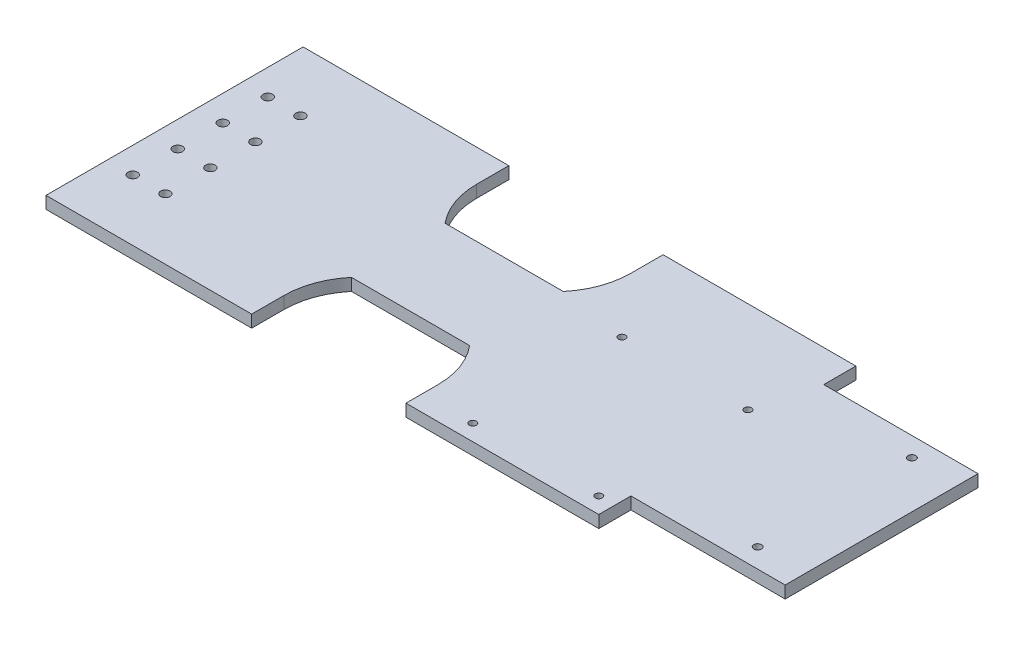
ISO-10303-21;
HEADER;
FILE_DESCRIPTION(('STEP AP214'),'2;1');
FILE_NAME('part.step','',(''),(''),'','','');
FILE_SCHEMA(('AUTOMOTIVE_DESIGN { 1 0 10303 214 1 1 1 1 }'));
ENDSEC;
DATA;
#1=APPLICATION_CONTEXT('core data for automotive mechanical design processes');
#2=APPLICATION_PROTOCOL_DEFINITION('international standard','automotive_design',2000,#1);
#3=PRODUCT_CONTEXT('',#1,'mechanical');
#4=PRODUCT('Part','Part','',(#3));
#5=PRODUCT_RELATED_PRODUCT_CATEGORY('part','',(#4));
#6=PRODUCT_DEFINITION_FORMATION('','',#4);
#7=PRODUCT_DEFINITION_CONTEXT('part definition',#1,'design');
#8=PRODUCT_DEFINITION('design','',#6,#7);
#9=PRODUCT_DEFINITION_SHAPE('','',#8);
#10=(LENGTH_UNIT() NAMED_UNIT(*) SI_UNIT(.MILLI.,.METRE.));
#11=(NAMED_UNIT(*) PLANE_ANGLE_UNIT() SI_UNIT($,.RADIAN.));
#12=(NAMED_UNIT(*) SI_UNIT($,.STERADIAN.) SOLID_ANGLE_UNIT());
#13=UNCERTAINTY_MEASURE_WITH_UNIT(LENGTH_MEASURE(1.E-05),#10,'distance_accuracy_value','');
#14=(GEOMETRIC_REPRESENTATION_CONTEXT(3) GLOBAL_UNCERTAINTY_ASSIGNED_CONTEXT((#13)) GLOBAL_UNIT_ASSIGNED_CONTEXT((#10,
#11,#12)) REPRESENTATION_CONTEXT('',''));
#15=CARTESIAN_POINT('',(0.,0.,0.));
#16=DIRECTION('',(0.,0.,1.));
#17=DIRECTION('',(1.,0.,0.));
#18=AXIS2_PLACEMENT_3D('',#15,#16,#17);
#19=CARTESIAN_POINT('',(-137.5,4.75,-50.));
#20=DIRECTION('',(0.,0.,1.));
#21=DIRECTION('',(1.,0.,0.));
#22=AXIS2_PLACEMENT_3D('',#19,#20,#21);
#23=PLANE('',#22);
#24=DIRECTION('',(-1.,0.,0.));
#25=VECTOR('',#24,1.);
#26=CARTESIAN_POINT('',(-137.5,4.75,-50.));
#27=LINE('',#26,#25);
#28=CARTESIAN_POINT('',(77.5,4.75,-50.));
#29=VERTEX_POINT('',#28);
#30=CARTESIAN_POINT('',(2.50000000000003,4.75,-50.));
#31=VERTEX_POINT('',#30);
#32=EDGE_CURVE('E193',#29,#31,#27,.T.);
#33=ORIENTED_EDGE('',*,*,#32,.F.);
#34=DIRECTION('',(0.,1.,0.));
#35=VECTOR('',#34,1.);
#36=CARTESIAN_POINT('',(77.5,-5.25,-50.));
#37=LINE('',#36,#35);
#38=CARTESIAN_POINT('',(77.5,0.,-50.));
#39=VERTEX_POINT('',#38);
#40=EDGE_CURVE('E422',#39,#29,#37,.T.);
#41=ORIENTED_EDGE('',*,*,#40,.F.);
#42=DIRECTION('',(-1.,0.,0.));
#43=VECTOR('',#42,1.);
#44=CARTESIAN_POINT('',(-137.5,0.,-50.));
#45=LINE('',#44,#43);
#46=CARTESIAN_POINT('',(2.50000000000003,0.,-50.));
#47=VERTEX_POINT('',#46);
#48=EDGE_CURVE('E195',#39,#47,#45,.T.);
#49=ORIENTED_EDGE('',*,*,#48,.T.);
#50=DIRECTION('',(0.,1.,0.));
#51=VECTOR('',#50,1.);
#52=CARTESIAN_POINT('',(2.50000000000003,-5.25,-50.));
#53=LINE('',#52,#51);
#54=EDGE_CURVE('E179',#47,#31,#53,.T.);
#55=ORIENTED_EDGE('',*,*,#54,.T.);
#56=EDGE_LOOP('',(#33,#41,#49,#55));
#57=FACE_BOUND('',#56,.T.);
#58=ADVANCED_FACE('F38',(#57),#23,.F.);
#59=CARTESIAN_POINT('',(-137.5,4.75,50.));
#60=DIRECTION('',(0.,0.,-1.));
#61=DIRECTION('',(-1.,0.,0.));
#62=AXIS2_PLACEMENT_3D('',#59,#60,#61);
#63=PLANE('',#62);
#64=DIRECTION('',(1.,0.,0.));
#65=VECTOR('',#64,1.);
#66=CARTESIAN_POINT('',(-137.5,4.75,50.));
#67=LINE('',#66,#65);
#68=CARTESIAN_POINT('',(2.50000000000002,4.75,50.));
#69=VERTEX_POINT('',#68);
#70=CARTESIAN_POINT('',(77.5,4.75,50.));
#71=VERTEX_POINT('',#70);
#72=EDGE_CURVE('E208',#69,#71,#67,.T.);
#73=ORIENTED_EDGE('',*,*,#72,.F.);
#74=DIRECTION('',(0.,1.,0.));
#75=VECTOR('',#74,1.);
#76=CARTESIAN_POINT('',(2.50000000000002,-5.25,50.));
#77=LINE('',#76,#75);
#78=CARTESIAN_POINT('',(2.50000000000002,0.,50.));
#79=VERTEX_POINT('',#78);
#80=EDGE_CURVE('E382',#79,#69,#77,.T.);
#81=ORIENTED_EDGE('',*,*,#80,.F.);
#82=DIRECTION('',(1.,0.,0.));
#83=VECTOR('',#82,1.);
#84=CARTESIAN_POINT('',(-137.5,0.,50.));
#85=LINE('',#84,#83);
#86=CARTESIAN_POINT('',(77.5,0.,50.));
#87=VERTEX_POINT('',#86);
#88=EDGE_CURVE('E226',#79,#87,#85,.T.);
#89=ORIENTED_EDGE('',*,*,#88,.T.);
#90=DIRECTION('',(0.,1.,0.));
#91=VECTOR('',#90,1.);
#92=CARTESIAN_POINT('',(77.5,-5.25,50.));
#93=LINE('',#92,#91);
#94=EDGE_CURVE('E413',#87,#71,#93,.T.);
#95=ORIENTED_EDGE('',*,*,#94,.T.);
#96=EDGE_LOOP('',(#73,#81,#89,#95));
#97=FACE_BOUND('',#96,.T.);
#98=ADVANCED_FACE('F331',(#97),#63,.F.);
#99=CARTESIAN_POINT('',(137.5,4.75,-50.));
#100=DIRECTION('',(-1.,0.,0.));
#101=DIRECTION('',(0.,0.,1.));
#102=AXIS2_PLACEMENT_3D('',#99,#100,#101);
#103=PLANE('',#102);
#104=DIRECTION('',(0.,0.,-1.));
#105=VECTOR('',#104,1.);
#106=CARTESIAN_POINT('',(137.5,0.,-50.));
#107=LINE('',#106,#105);
#108=CARTESIAN_POINT('',(137.5,0.,37.5));
#109=VERTEX_POINT('',#108);
#110=CARTESIAN_POINT('',(137.5,0.,-37.5));
#111=VERTEX_POINT('',#110);
#112=EDGE_CURVE('E218',#109,#111,#107,.T.);
#113=ORIENTED_EDGE('',*,*,#112,.T.);
#114=DIRECTION('',(0.,1.,0.));
#115=VECTOR('',#114,1.);
#116=CARTESIAN_POINT('',(137.5,-5.25,-37.5));
#117=LINE('',#116,#115);
#118=CARTESIAN_POINT('',(137.5,4.75,-37.5));
#119=VERTEX_POINT('',#118);
#120=EDGE_CURVE('E410',#111,#119,#117,.T.);
#121=ORIENTED_EDGE('',*,*,#120,.T.);
#122=DIRECTION('',(0.,0.,-1.));
#123=VECTOR('',#122,1.);
#124=CARTESIAN_POINT('',(137.5,4.75,-50.));
#125=LINE('',#124,#123);
#126=CARTESIAN_POINT('',(137.5,4.75,37.5));
#127=VERTEX_POINT('',#126);
#128=EDGE_CURVE('E210',#127,#119,#125,.T.);
#129=ORIENTED_EDGE('',*,*,#128,.F.);
#130=DIRECTION('',(0.,1.,0.));
#131=VECTOR('',#130,1.);
#132=CARTESIAN_POINT('',(137.5,-5.25,37.5));
#133=LINE('',#132,#131);
#134=EDGE_CURVE('E412',#109,#127,#133,.T.);
#135=ORIENTED_EDGE('',*,*,#134,.F.);
#136=EDGE_LOOP('',(#113,#121,#129,#135));
#137=FACE_BOUND('',#136,.T.);
#138=ADVANCED_FACE('F40',(#137),#103,.F.);
#139=CARTESIAN_POINT('',(-57.5,4.75,-50.));
#140=VERTEX_POINT('',#139);
#141=CARTESIAN_POINT('',(-137.5,4.75,-50.));
#142=VERTEX_POINT('',#141);
#143=EDGE_CURVE('E206',#140,#142,#27,.T.);
#144=ORIENTED_EDGE('',*,*,#143,.F.);
#145=DIRECTION('',(0.,1.,0.));
#146=VECTOR('',#145,1.);
#147=CARTESIAN_POINT('',(-57.5,-5.25,-50.));
#148=LINE('',#147,#146);
#149=CARTESIAN_POINT('',(-57.5,0.,-50.));
#150=VERTEX_POINT('',#149);
#151=EDGE_CURVE('E196',#150,#140,#148,.T.);
#152=ORIENTED_EDGE('',*,*,#151,.F.);
#153=CARTESIAN_POINT('',(-137.5,0.,-50.));
#154=VERTEX_POINT('',#153);
#155=EDGE_CURVE('E221',#150,#154,#45,.T.);
#156=ORIENTED_EDGE('',*,*,#155,.T.);
#157=DIRECTION('',(0.,-1.,0.));
#158=VECTOR('',#157,1.);
#159=CARTESIAN_POINT('',(-137.5,4.75,-50.));
#160=LINE('',#159,#158);
#161=EDGE_CURVE('E232',#142,#154,#160,.T.);
#162=ORIENTED_EDGE('',*,*,#161,.F.);
#163=EDGE_LOOP('',(#144,#152,#156,#162));
#164=FACE_BOUND('',#163,.T.);
#165=ADVANCED_FACE('F332',(#164),#23,.F.);
#166=CARTESIAN_POINT('',(-137.5,4.75,-50.));
#167=DIRECTION('',(1.,0.,0.));
#168=DIRECTION('',(0.,0.,-1.));
#169=AXIS2_PLACEMENT_3D('',#166,#167,#168);
#170=PLANE('',#169);
#171=DIRECTION('',(0.,0.,1.));
#172=VECTOR('',#171,1.);
#173=CARTESIAN_POINT('',(-137.5,0.,-50.));
#174=LINE('',#173,#172);
#175=CARTESIAN_POINT('',(-137.5,0.,50.));
#176=VERTEX_POINT('',#175);
#177=EDGE_CURVE('E224',#154,#176,#174,.T.);
#178=ORIENTED_EDGE('',*,*,#177,.T.);
#179=DIRECTION('',(0.,-1.,0.));
#180=VECTOR('',#179,1.);
#181=CARTESIAN_POINT('',(-137.5,4.75,50.));
#182=LINE('',#181,#180);
#183=CARTESIAN_POINT('',(-137.5,4.75,50.));
#184=VERTEX_POINT('',#183);
#185=EDGE_CURVE('E217',#184,#176,#182,.T.);
#186=ORIENTED_EDGE('',*,*,#185,.F.);
#187=DIRECTION('',(0.,0.,1.));
#188=VECTOR('',#187,1.);
#189=CARTESIAN_POINT('',(-137.5,4.75,-50.));
#190=LINE('',#189,#188);
#191=EDGE_CURVE('E205',#142,#184,#190,.T.);
#192=ORIENTED_EDGE('',*,*,#191,.F.);
#193=ORIENTED_EDGE('',*,*,#161,.T.);
#194=EDGE_LOOP('',(#178,#186,#192,#193));
#195=FACE_BOUND('',#194,.T.);
#196=ADVANCED_FACE('F341',(#195),#170,.F.);
#197=CARTESIAN_POINT('',(-57.5,0.,50.));
#198=VERTEX_POINT('',#197);
#199=EDGE_CURVE('E227',#176,#198,#85,.T.);
#200=ORIENTED_EDGE('',*,*,#199,.T.);
#201=DIRECTION('',(0.,1.,0.));
#202=VECTOR('',#201,1.);
#203=CARTESIAN_POINT('',(-57.5,-5.25,50.));
#204=LINE('',#203,#202);
#205=CARTESIAN_POINT('',(-57.5,4.75,50.));
#206=VERTEX_POINT('',#205);
#207=EDGE_CURVE('E397',#198,#206,#204,.T.);
#208=ORIENTED_EDGE('',*,*,#207,.T.);
#209=EDGE_CURVE('E214',#184,#206,#67,.T.);
#210=ORIENTED_EDGE('',*,*,#209,.F.);
#211=ORIENTED_EDGE('',*,*,#185,.T.);
#212=EDGE_LOOP('',(#200,#208,#210,#211));
#213=FACE_BOUND('',#212,.T.);
#214=ADVANCED_FACE('F338',(#213),#63,.F.);
#215=CARTESIAN_POINT('',(0.,4.75,0.));
#216=DIRECTION('',(0.,1.,0.));
#217=DIRECTION('',(0.,0.,1.));
#218=AXIS2_PLACEMENT_3D('',#215,#216,#217);
#219=PLANE('',#218);
#220=CARTESIAN_POINT('',(-127.5,4.75,-8.75000000000001));
#221=DIRECTION('',(0.,1.,0.));
#222=DIRECTION('',(0.,0.,1.));
#223=AXIS2_PLACEMENT_3D('',#220,#221,#222);
#224=CIRCLE('',#223,1.85);
#225=CARTESIAN_POINT('',(-127.5,4.75,-6.9));
#226=VERTEX_POINT('',#225);
#227=EDGE_CURVE('E615',#226,#226,#224,.T.);
#228=ORIENTED_EDGE('',*,*,#227,.F.);
#229=EDGE_LOOP('',(#228));
#230=FACE_BOUND('',#229,.T.);
#231=CARTESIAN_POINT('',(-114.8,4.75,-26.25));
#232=DIRECTION('',(0.,1.,0.));
#233=DIRECTION('',(0.,0.,1.));
#234=AXIS2_PLACEMENT_3D('',#231,#232,#233);
#235=CIRCLE('',#234,1.85);
#236=CARTESIAN_POINT('',(-114.8,4.75,-24.4));
#237=VERTEX_POINT('',#236);
#238=EDGE_CURVE('E609',#237,#237,#235,.T.);
#239=ORIENTED_EDGE('',*,*,#238,.F.);
#240=EDGE_LOOP('',(#239));
#241=FACE_BOUND('',#240,.T.);
#242=CARTESIAN_POINT('',(-127.5,4.75,-26.25));
#243=DIRECTION('',(0.,1.,0.));
#244=DIRECTION('',(0.,0.,1.));
#245=AXIS2_PLACEMENT_3D('',#242,#243,#244);
#246=CIRCLE('',#245,1.85000000000001);
#247=CARTESIAN_POINT('',(-127.5,4.75,-24.4));
#248=VERTEX_POINT('',#247);
#249=EDGE_CURVE('E605',#248,#248,#246,.T.);
#250=ORIENTED_EDGE('',*,*,#249,.F.);
#251=EDGE_LOOP('',(#250));
#252=FACE_BOUND('',#251,.T.);
#253=CARTESIAN_POINT('',(71.25,4.75,43.75));
#254=DIRECTION('',(0.,1.,0.));
#255=DIRECTION('',(0.,0.,1.));
#256=AXIS2_PLACEMENT_3D('',#253,#254,#255);
#257=CIRCLE('',#256,1.375);
#258=CARTESIAN_POINT('',(71.25,4.75,45.125));
#259=VERTEX_POINT('',#258);
#260=EDGE_CURVE('E595',#259,#259,#257,.T.);
#261=ORIENTED_EDGE('',*,*,#260,.F.);
#262=EDGE_LOOP('',(#261));
#263=FACE_BOUND('',#262,.T.);
#264=CARTESIAN_POINT('',(-114.8,4.75,26.25));
#265=DIRECTION('',(0.,1.,0.));
#266=DIRECTION('',(0.,0.,1.));
#267=AXIS2_PLACEMENT_3D('',#264,#265,#266);
#268=CIRCLE('',#267,1.85);
#269=CARTESIAN_POINT('',(-114.8,4.75,28.1));
#270=VERTEX_POINT('',#269);
#271=EDGE_CURVE('E624',#270,#270,#268,.T.);
#272=ORIENTED_EDGE('',*,*,#271,.F.);
#273=EDGE_LOOP('',(#272));
#274=FACE_BOUND('',#273,.T.);
#275=CARTESIAN_POINT('',(-127.5,4.75,8.75));
#276=DIRECTION('',(0.,1.,0.));
#277=DIRECTION('',(0.,0.,1.));
#278=AXIS2_PLACEMENT_3D('',#275,#276,#277);
#279=CIRCLE('',#278,1.85000000000001);
#280=CARTESIAN_POINT('',(-127.5,4.75,10.6));
#281=VERTEX_POINT('',#280);
#282=EDGE_CURVE('E621',#281,#281,#279,.T.);
#283=ORIENTED_EDGE('',*,*,#282,.F.);
#284=EDGE_LOOP('',(#283));
#285=FACE_BOUND('',#284,.T.);
#286=CARTESIAN_POINT('',(-114.8,4.75,8.74999999999999));
#287=DIRECTION('',(0.,1.,0.));
#288=DIRECTION('',(0.,0.,1.));
#289=AXIS2_PLACEMENT_3D('',#286,#287,#288);
#290=CIRCLE('',#289,1.85);
#291=CARTESIAN_POINT('',(-114.8,4.75,10.6));
#292=VERTEX_POINT('',#291);
#293=EDGE_CURVE('E528',#292,#292,#290,.T.);
#294=ORIENTED_EDGE('',*,*,#293,.F.);
#295=EDGE_LOOP('',(#294));
#296=FACE_BOUND('',#295,.T.);
#297=CARTESIAN_POINT('',(-114.8,4.75,-8.75000000000001));
#298=DIRECTION('',(0.,1.,0.));
#299=DIRECTION('',(0.,0.,1.));
#300=AXIS2_PLACEMENT_3D('',#297,#298,#299);
#301=CIRCLE('',#300,1.85);
#302=CARTESIAN_POINT('',(-114.8,4.75,-6.9));
#303=VERTEX_POINT('',#302);
#304=EDGE_CURVE('E617',#303,#303,#301,.T.);
#305=ORIENTED_EDGE('',*,*,#304,.F.);
#306=EDGE_LOOP('',(#305));
#307=FACE_BOUND('',#306,.T.);
#308=CARTESIAN_POINT('',(22.25,4.75,-14.25));
#309=DIRECTION('',(0.,1.,0.));
#310=DIRECTION('',(0.,0.,1.));
#311=AXIS2_PLACEMENT_3D('',#308,#309,#310);
#312=CIRCLE('',#311,1.375);
#313=CARTESIAN_POINT('',(22.25,4.75,-12.875));
#314=VERTEX_POINT('',#313);
#315=EDGE_CURVE('E640',#314,#314,#312,.T.);
#316=ORIENTED_EDGE('',*,*,#315,.F.);
#317=EDGE_LOOP('',(#316));
#318=FACE_BOUND('',#317,.T.);
#319=CARTESIAN_POINT('',(71.25,4.75,-14.25));
#320=DIRECTION('',(0.,1.,0.));
#321=DIRECTION('',(0.,0.,1.));
#322=AXIS2_PLACEMENT_3D('',#319,#320,#321);
#323=CIRCLE('',#322,1.375);
#324=CARTESIAN_POINT('',(71.25,4.75,-12.875));
#325=VERTEX_POINT('',#324);
#326=EDGE_CURVE('E611',#325,#325,#323,.T.);
#327=ORIENTED_EDGE('',*,*,#326,.F.);
#328=EDGE_LOOP('',(#327));
#329=FACE_BOUND('',#328,.T.);
#330=CARTESIAN_POINT('',(22.25,4.75,43.75));
#331=DIRECTION('',(0.,1.,0.));
#332=DIRECTION('',(0.,0.,1.));
#333=AXIS2_PLACEMENT_3D('',#330,#331,#332);
#334=CIRCLE('',#333,1.375);
#335=CARTESIAN_POINT('',(22.25,4.75,45.125));
#336=VERTEX_POINT('',#335);
#337=EDGE_CURVE('E606',#336,#336,#334,.T.);
#338=ORIENTED_EDGE('',*,*,#337,.F.);
#339=EDGE_LOOP('',(#338));
#340=FACE_BOUND('',#339,.T.);
#341=CARTESIAN_POINT('',(-127.5,4.75,26.25));
#342=DIRECTION('',(0.,1.,0.));
#343=DIRECTION('',(0.,0.,1.));
#344=AXIS2_PLACEMENT_3D('',#341,#342,#343);
#345=CIRCLE('',#344,1.85000000000001);
#346=CARTESIAN_POINT('',(-127.5,4.75,28.1));
#347=VERTEX_POINT('',#346);
#348=EDGE_CURVE('E282',#347,#347,#345,.T.);
#349=ORIENTED_EDGE('',*,*,#348,.F.);
#350=EDGE_LOOP('',(#349));
#351=FACE_BOUND('',#350,.T.);
#352=DIRECTION('',(0.,0.,-1.));
#353=VECTOR('',#352,1.);
#354=CARTESIAN_POINT('',(2.50000000000002,4.75,50.));
#355=LINE('',#354,#353);
#356=CARTESIAN_POINT('',(2.50000000000002,4.75,37.5));
#357=VERTEX_POINT('',#356);
#358=EDGE_CURVE('E371',#69,#357,#355,.T.);
#359=ORIENTED_EDGE('',*,*,#358,.F.);
#360=ORIENTED_EDGE('',*,*,#72,.T.);
#361=DIRECTION('',(0.,0.,1.));
#362=VECTOR('',#361,1.);
#363=CARTESIAN_POINT('',(77.5,4.75,50.));
#364=LINE('',#363,#362);
#365=CARTESIAN_POINT('',(77.5,4.75,37.5));
#366=VERTEX_POINT('',#365);
#367=EDGE_CURVE('E409',#366,#71,#364,.T.);
#368=ORIENTED_EDGE('',*,*,#367,.F.);
#369=DIRECTION('',(-1.,0.,0.));
#370=VECTOR('',#369,1.);
#371=CARTESIAN_POINT('',(137.5,4.75,37.5));
#372=LINE('',#371,#370);
#373=EDGE_CURVE('E406',#127,#366,#372,.T.);
#374=ORIENTED_EDGE('',*,*,#373,.F.);
#375=ORIENTED_EDGE('',*,*,#128,.T.);
#376=DIRECTION('',(1.,0.,0.));
#377=VECTOR('',#376,1.);
#378=CARTESIAN_POINT('',(137.5,4.75,-37.5));
#379=LINE('',#378,#377);
#380=CARTESIAN_POINT('',(77.5,4.75,-37.5));
#381=VERTEX_POINT('',#380);
#382=EDGE_CURVE('E420',#381,#119,#379,.T.);
#383=ORIENTED_EDGE('',*,*,#382,.F.);
#384=DIRECTION('',(0.,0.,1.));
#385=VECTOR('',#384,1.);
#386=CARTESIAN_POINT('',(77.5,4.75,-50.));
#387=LINE('',#386,#385);
#388=EDGE_CURVE('E204',#29,#381,#387,.T.);
#389=ORIENTED_EDGE('',*,*,#388,.F.);
#390=ORIENTED_EDGE('',*,*,#32,.T.);
#391=DIRECTION('',(0.,0.,-1.));
#392=VECTOR('',#391,1.);
#393=CARTESIAN_POINT('',(2.50000000000003,4.75,-50.));
#394=LINE('',#393,#392);
#395=CARTESIAN_POINT('',(2.50000000000002,4.75,-37.5));
#396=VERTEX_POINT('',#395);
#397=EDGE_CURVE('E176',#396,#31,#394,.T.);
#398=ORIENTED_EDGE('',*,*,#397,.F.);
#399=CARTESIAN_POINT('',(-27.5,4.75,-37.5));
#400=DIRECTION('',(0.,1.,0.));
#401=DIRECTION('',(0.,0.,-1.));
#402=AXIS2_PLACEMENT_3D('',#399,#400,#401);
#403=CIRCLE('',#402,30.);
#404=CARTESIAN_POINT('',(-4.51866670643041,4.75,-18.2163717094041));
#405=VERTEX_POINT('',#404);
#406=EDGE_CURVE('E197',#405,#396,#403,.T.);
#407=ORIENTED_EDGE('',*,*,#406,.F.);
#408=DIRECTION('',(1.,0.,0.));
#409=VECTOR('',#408,1.);
#410=CARTESIAN_POINT('',(-4.51866670643041,4.75,-18.2163717094041));
#411=LINE('',#410,#409);
#412=CARTESIAN_POINT('',(-50.4813332935696,4.75,-18.2163717094041));
#413=VERTEX_POINT('',#412);
#414=EDGE_CURVE('E363',#413,#405,#411,.T.);
#415=ORIENTED_EDGE('',*,*,#414,.F.);
#416=CARTESIAN_POINT('',(-27.5,4.75,-37.5));
#417=DIRECTION('',(0.,1.,0.));
#418=DIRECTION('',(0.,0.,1.));
#419=AXIS2_PLACEMENT_3D('',#416,#417,#418);
#420=CIRCLE('',#419,30.);
#421=CARTESIAN_POINT('',(-57.5,4.75,-37.5));
#422=VERTEX_POINT('',#421);
#423=EDGE_CURVE('E360',#422,#413,#420,.T.);
#424=ORIENTED_EDGE('',*,*,#423,.F.);
#425=DIRECTION('',(0.,0.,1.));
#426=VECTOR('',#425,1.);
#427=CARTESIAN_POINT('',(-57.5,4.75,-50.));
#428=LINE('',#427,#426);
#429=EDGE_CURVE('E187',#140,#422,#428,.T.);
#430=ORIENTED_EDGE('',*,*,#429,.F.);
#431=ORIENTED_EDGE('',*,*,#143,.T.);
#432=ORIENTED_EDGE('',*,*,#191,.T.);
#433=ORIENTED_EDGE('',*,*,#209,.T.);
#434=DIRECTION('',(0.,0.,1.));
#435=VECTOR('',#434,1.);
#436=CARTESIAN_POINT('',(-57.5,4.75,50.));
#437=LINE('',#436,#435);
#438=CARTESIAN_POINT('',(-57.5,4.75,37.5));
#439=VERTEX_POINT('',#438);
#440=EDGE_CURVE('E393',#439,#206,#437,.T.);
#441=ORIENTED_EDGE('',*,*,#440,.F.);
#442=CARTESIAN_POINT('',(-27.5,4.75,37.5));
#443=DIRECTION('',(0.,1.,0.));
#444=DIRECTION('',(0.,0.,-1.));
#445=AXIS2_PLACEMENT_3D('',#442,#443,#444);
#446=CIRCLE('',#445,30.);
#447=CARTESIAN_POINT('',(-50.4813332935696,4.75,18.2163717094041));
#448=VERTEX_POINT('',#447);
#449=EDGE_CURVE('E390',#448,#439,#446,.T.);
#450=ORIENTED_EDGE('',*,*,#449,.F.);
#451=DIRECTION('',(-1.,0.,0.));
#452=VECTOR('',#451,1.);
#453=CARTESIAN_POINT('',(-50.4813332935695,4.75,18.2163717094041));
#454=LINE('',#453,#452);
#455=CARTESIAN_POINT('',(-4.5186667064304,4.75,18.2163717094041));
#456=VERTEX_POINT('',#455);
#457=EDGE_CURVE('E387',#456,#448,#454,.T.);
#458=ORIENTED_EDGE('',*,*,#457,.F.);
#459=CARTESIAN_POINT('',(-27.5,4.75,37.5));
#460=DIRECTION('',(0.,1.,0.));
#461=DIRECTION('',(0.,0.,1.));
#462=AXIS2_PLACEMENT_3D('',#459,#460,#461);
#463=CIRCLE('',#462,30.);
#464=EDGE_CURVE('E385',#357,#456,#463,.T.);
#465=ORIENTED_EDGE('',*,*,#464,.F.);
#466=EDGE_LOOP('',(#359,#360,#368,#374,#375,#383,#389,#390,#398,#407,#415,#424,#430,#431,#432,
#433,#441,#450,#458,#465));
#467=FACE_BOUND('',#466,.T.);
#468=CARTESIAN_POINT('',(119.3,4.75,-30.));
#469=DIRECTION('',(0.,1.,0.));
#470=DIRECTION('',(0.,0.,1.));
#471=AXIS2_PLACEMENT_3D('',#468,#469,#470);
#472=CIRCLE('',#471,1.49999999999997);
#473=CARTESIAN_POINT('',(119.3,4.75,-28.5));
#474=VERTEX_POINT('',#473);
#475=EDGE_CURVE('E379',#474,#474,#472,.T.);
#476=ORIENTED_EDGE('',*,*,#475,.F.);
#477=EDGE_LOOP('',(#476));
#478=FACE_BOUND('',#477,.T.);
#479=CARTESIAN_POINT('',(119.3,4.75,30.));
#480=DIRECTION('',(0.,1.,0.));
#481=DIRECTION('',(0.,0.,1.));
#482=AXIS2_PLACEMENT_3D('',#479,#480,#481);
#483=CIRCLE('',#482,1.49999999999998);
#484=CARTESIAN_POINT('',(119.3,4.75,31.5));
#485=VERTEX_POINT('',#484);
#486=EDGE_CURVE('E239',#485,#485,#483,.T.);
#487=ORIENTED_EDGE('',*,*,#486,.F.);
#488=EDGE_LOOP('',(#487));
#489=FACE_BOUND('',#488,.T.);
#490=ADVANCED_FACE('F201',(#230,#241,#252,#263,#274,#285,#296,#307,#318,#329,#340,#351,#467,
#478,#489),#219,.T.);
#491=CARTESIAN_POINT('',(0.,0.,0.));
#492=DIRECTION('',(0.,1.,0.));
#493=DIRECTION('',(0.,0.,1.));
#494=AXIS2_PLACEMENT_3D('',#491,#492,#493);
#495=PLANE('',#494);
#496=CARTESIAN_POINT('',(-127.5,0.,-8.75000000000001));
#497=DIRECTION('',(0.,1.,0.));
#498=DIRECTION('',(0.,0.,1.));
#499=AXIS2_PLACEMENT_3D('',#496,#497,#498);
#500=CIRCLE('',#499,1.85);
#501=CARTESIAN_POINT('',(-127.5,0.,-6.9));
#502=VERTEX_POINT('',#501);
#503=EDGE_CURVE('E42',#502,#502,#500,.T.);
#504=ORIENTED_EDGE('',*,*,#503,.T.);
#505=EDGE_LOOP('',(#504));
#506=FACE_BOUND('',#505,.T.);
#507=CARTESIAN_POINT('',(-114.8,0.,-26.25));
#508=DIRECTION('',(0.,1.,0.));
#509=DIRECTION('',(0.,0.,1.));
#510=AXIS2_PLACEMENT_3D('',#507,#508,#509);
#511=CIRCLE('',#510,1.85);
#512=CARTESIAN_POINT('',(-114.8,0.,-24.4));
#513=VERTEX_POINT('',#512);
#514=EDGE_CURVE('E308',#513,#513,#511,.T.);
#515=ORIENTED_EDGE('',*,*,#514,.T.);
#516=EDGE_LOOP('',(#515));
#517=FACE_BOUND('',#516,.T.);
#518=CARTESIAN_POINT('',(-127.5,0.,-26.25));
#519=DIRECTION('',(0.,1.,0.));
#520=DIRECTION('',(0.,0.,1.));
#521=AXIS2_PLACEMENT_3D('',#518,#519,#520);
#522=CIRCLE('',#521,1.85000000000001);
#523=CARTESIAN_POINT('',(-127.5,0.,-24.4));
#524=VERTEX_POINT('',#523);
#525=EDGE_CURVE('E306',#524,#524,#522,.T.);
#526=ORIENTED_EDGE('',*,*,#525,.T.);
#527=EDGE_LOOP('',(#526));
#528=FACE_BOUND('',#527,.T.);
#529=CARTESIAN_POINT('',(71.25,0.,43.75));
#530=DIRECTION('',(0.,1.,0.));
#531=DIRECTION('',(0.,0.,1.));
#532=AXIS2_PLACEMENT_3D('',#529,#530,#531);
#533=CIRCLE('',#532,1.375);
#534=CARTESIAN_POINT('',(71.25,0.,45.125));
#535=VERTEX_POINT('',#534);
#536=EDGE_CURVE('E303',#535,#535,#533,.T.);
#537=ORIENTED_EDGE('',*,*,#536,.T.);
#538=EDGE_LOOP('',(#537));
#539=FACE_BOUND('',#538,.T.);
#540=CARTESIAN_POINT('',(-114.8,0.,26.25));
#541=DIRECTION('',(0.,1.,0.));
#542=DIRECTION('',(0.,0.,1.));
#543=AXIS2_PLACEMENT_3D('',#540,#541,#542);
#544=CIRCLE('',#543,1.85);
#545=CARTESIAN_POINT('',(-114.8,0.,28.1));
#546=VERTEX_POINT('',#545);
#547=EDGE_CURVE('E300',#546,#546,#544,.T.);
#548=ORIENTED_EDGE('',*,*,#547,.T.);
#549=EDGE_LOOP('',(#548));
#550=FACE_BOUND('',#549,.T.);
#551=CARTESIAN_POINT('',(-127.5,0.,8.75));
#552=DIRECTION('',(0.,1.,0.));
#553=DIRECTION('',(0.,0.,1.));
#554=AXIS2_PLACEMENT_3D('',#551,#552,#553);
#555=CIRCLE('',#554,1.85000000000001);
#556=CARTESIAN_POINT('',(-127.5,0.,10.6));
#557=VERTEX_POINT('',#556);
#558=EDGE_CURVE('E297',#557,#557,#555,.T.);
#559=ORIENTED_EDGE('',*,*,#558,.T.);
#560=EDGE_LOOP('',(#559));
#561=FACE_BOUND('',#560,.T.);
#562=CARTESIAN_POINT('',(-114.8,0.,8.74999999999999));
#563=DIRECTION('',(0.,1.,0.));
#564=DIRECTION('',(0.,0.,1.));
#565=AXIS2_PLACEMENT_3D('',#562,#563,#564);
#566=CIRCLE('',#565,1.85);
#567=CARTESIAN_POINT('',(-114.8,0.,10.6));
#568=VERTEX_POINT('',#567);
#569=EDGE_CURVE('E294',#568,#568,#566,.T.);
#570=ORIENTED_EDGE('',*,*,#569,.T.);
#571=EDGE_LOOP('',(#570));
#572=FACE_BOUND('',#571,.T.);
#573=CARTESIAN_POINT('',(-114.8,0.,-8.75000000000001));
#574=DIRECTION('',(0.,1.,0.));
#575=DIRECTION('',(0.,0.,1.));
#576=AXIS2_PLACEMENT_3D('',#573,#574,#575);
#577=CIRCLE('',#576,1.85);
#578=CARTESIAN_POINT('',(-114.8,0.,-6.9));
#579=VERTEX_POINT('',#578);
#580=EDGE_CURVE('E291',#579,#579,#577,.T.);
#581=ORIENTED_EDGE('',*,*,#580,.T.);
#582=EDGE_LOOP('',(#581));
#583=FACE_BOUND('',#582,.T.);
#584=CARTESIAN_POINT('',(22.25,0.,-14.25));
#585=DIRECTION('',(0.,1.,0.));
#586=DIRECTION('',(0.,0.,1.));
#587=AXIS2_PLACEMENT_3D('',#584,#585,#586);
#588=CIRCLE('',#587,1.375);
#589=CARTESIAN_POINT('',(22.25,0.,-12.875));
#590=VERTEX_POINT('',#589);
#591=EDGE_CURVE('E288',#590,#590,#588,.T.);
#592=ORIENTED_EDGE('',*,*,#591,.T.);
#593=EDGE_LOOP('',(#592));
#594=FACE_BOUND('',#593,.T.);
#595=CARTESIAN_POINT('',(71.25,0.,-14.25));
#596=DIRECTION('',(0.,1.,0.));
#597=DIRECTION('',(0.,0.,1.));
#598=AXIS2_PLACEMENT_3D('',#595,#596,#597);
#599=CIRCLE('',#598,1.375);
#600=CARTESIAN_POINT('',(71.25,0.,-12.875));
#601=VERTEX_POINT('',#600);
#602=EDGE_CURVE('E285',#601,#601,#599,.T.);
#603=ORIENTED_EDGE('',*,*,#602,.T.);
#604=EDGE_LOOP('',(#603));
#605=FACE_BOUND('',#604,.T.);
#606=CARTESIAN_POINT('',(22.25,0.,43.75));
#607=DIRECTION('',(0.,1.,0.));
#608=DIRECTION('',(0.,0.,1.));
#609=AXIS2_PLACEMENT_3D('',#606,#607,#608);
#610=CIRCLE('',#609,1.375);
#611=CARTESIAN_POINT('',(22.25,0.,45.125));
#612=VERTEX_POINT('',#611);
#613=EDGE_CURVE('E281',#612,#612,#610,.T.);
#614=ORIENTED_EDGE('',*,*,#613,.T.);
#615=EDGE_LOOP('',(#614));
#616=FACE_BOUND('',#615,.T.);
#617=CARTESIAN_POINT('',(-127.5,0.,26.25));
#618=DIRECTION('',(0.,1.,0.));
#619=DIRECTION('',(0.,0.,1.));
#620=AXIS2_PLACEMENT_3D('',#617,#618,#619);
#621=CIRCLE('',#620,1.85000000000001);
#622=CARTESIAN_POINT('',(-127.5,0.,28.1));
#623=VERTEX_POINT('',#622);
#624=EDGE_CURVE('E278',#623,#623,#621,.T.);
#625=ORIENTED_EDGE('',*,*,#624,.T.);
#626=EDGE_LOOP('',(#625));
#627=FACE_BOUND('',#626,.T.);
#628=ORIENTED_EDGE('',*,*,#88,.F.);
#629=DIRECTION('',(0.,0.,-1.));
#630=VECTOR('',#629,1.);
#631=CARTESIAN_POINT('',(2.50000000000002,0.,0.));
#632=LINE('',#631,#630);
#633=CARTESIAN_POINT('',(2.50000000000002,0.,37.5));
#634=VERTEX_POINT('',#633);
#635=EDGE_CURVE('E11',#79,#634,#632,.T.);
#636=ORIENTED_EDGE('',*,*,#635,.T.);
#637=CARTESIAN_POINT('',(-27.5,0.,37.5));
#638=DIRECTION('',(0.,1.,0.));
#639=DIRECTION('',(0.,0.,1.));
#640=AXIS2_PLACEMENT_3D('',#637,#638,#639);
#641=CIRCLE('',#640,30.);
#642=CARTESIAN_POINT('',(-4.5186667064304,0.,18.2163717094041));
#643=VERTEX_POINT('',#642);
#644=EDGE_CURVE('E265',#634,#643,#641,.T.);
#645=ORIENTED_EDGE('',*,*,#644,.T.);
#646=DIRECTION('',(-1.,0.,0.));
#647=VECTOR('',#646,1.);
#648=CARTESIAN_POINT('',(0.,0.,18.2163717094041));
#649=LINE('',#648,#647);
#650=CARTESIAN_POINT('',(-50.4813332935696,0.,18.2163717094041));
#651=VERTEX_POINT('',#650);
#652=EDGE_CURVE('E270',#643,#651,#649,.T.);
#653=ORIENTED_EDGE('',*,*,#652,.T.);
#654=CARTESIAN_POINT('',(-27.5,0.,37.5));
#655=DIRECTION('',(0.,1.,0.));
#656=DIRECTION('',(0.,0.,1.));
#657=AXIS2_PLACEMENT_3D('',#654,#655,#656);
#658=CIRCLE('',#657,30.);
#659=CARTESIAN_POINT('',(-57.5,0.,37.5));
#660=VERTEX_POINT('',#659);
#661=EDGE_CURVE('E273',#651,#660,#658,.T.);
#662=ORIENTED_EDGE('',*,*,#661,.T.);
#663=DIRECTION('',(0.,0.,1.));
#664=VECTOR('',#663,1.);
#665=CARTESIAN_POINT('',(-57.5,0.,0.));
#666=LINE('',#665,#664);
#667=EDGE_CURVE('E47',#660,#198,#666,.T.);
#668=ORIENTED_EDGE('',*,*,#667,.T.);
#669=ORIENTED_EDGE('',*,*,#199,.F.);
#670=ORIENTED_EDGE('',*,*,#177,.F.);
#671=ORIENTED_EDGE('',*,*,#155,.F.);
#672=DIRECTION('',(0.,0.,1.));
#673=VECTOR('',#672,1.);
#674=CARTESIAN_POINT('',(-57.5,0.,0.));
#675=LINE('',#674,#673);
#676=CARTESIAN_POINT('',(-57.5,0.,-37.5));
#677=VERTEX_POINT('',#676);
#678=EDGE_CURVE('E235',#150,#677,#675,.T.);
#679=ORIENTED_EDGE('',*,*,#678,.T.);
#680=CARTESIAN_POINT('',(-27.5,0.,-37.5));
#681=DIRECTION('',(0.,1.,0.));
#682=DIRECTION('',(0.,0.,1.));
#683=AXIS2_PLACEMENT_3D('',#680,#681,#682);
#684=CIRCLE('',#683,30.);
#685=CARTESIAN_POINT('',(-50.4813332935696,0.,-18.2163717094041));
#686=VERTEX_POINT('',#685);
#687=EDGE_CURVE('E242',#677,#686,#684,.T.);
#688=ORIENTED_EDGE('',*,*,#687,.T.);
#689=DIRECTION('',(1.,0.,0.));
#690=VECTOR('',#689,1.);
#691=CARTESIAN_POINT('',(0.,0.,-18.2163717094041));
#692=LINE('',#691,#690);
#693=CARTESIAN_POINT('',(-4.51866670643041,0.,-18.2163717094041));
#694=VERTEX_POINT('',#693);
#695=EDGE_CURVE('E245',#686,#694,#692,.T.);
#696=ORIENTED_EDGE('',*,*,#695,.T.);
#697=CARTESIAN_POINT('',(-27.5,0.,-37.5));
#698=DIRECTION('',(0.,1.,0.));
#699=DIRECTION('',(0.,0.,1.));
#700=AXIS2_PLACEMENT_3D('',#697,#698,#699);
#701=CIRCLE('',#700,30.);
#702=CARTESIAN_POINT('',(2.50000000000002,0.,-37.5));
#703=VERTEX_POINT('',#702);
#704=EDGE_CURVE('E248',#694,#703,#701,.T.);
#705=ORIENTED_EDGE('',*,*,#704,.T.);
#706=DIRECTION('',(0.,0.,-1.));
#707=VECTOR('',#706,1.);
#708=CARTESIAN_POINT('',(2.50000000000003,0.,0.));
#709=LINE('',#708,#707);
#710=EDGE_CURVE('E251',#703,#47,#709,.T.);
#711=ORIENTED_EDGE('',*,*,#710,.T.);
#712=ORIENTED_EDGE('',*,*,#48,.F.);
#713=DIRECTION('',(0.,0.,1.));
#714=VECTOR('',#713,1.);
#715=CARTESIAN_POINT('',(77.5,0.,0.));
#716=LINE('',#715,#714);
#717=CARTESIAN_POINT('',(77.5,0.,-37.5));
#718=VERTEX_POINT('',#717);
#719=EDGE_CURVE('E259',#39,#718,#716,.T.);
#720=ORIENTED_EDGE('',*,*,#719,.T.);
#721=DIRECTION('',(1.,0.,0.));
#722=VECTOR('',#721,1.);
#723=CARTESIAN_POINT('',(0.,0.,-37.5));
#724=LINE('',#723,#722);
#725=EDGE_CURVE('E262',#718,#111,#724,.T.);
#726=ORIENTED_EDGE('',*,*,#725,.T.);
#727=ORIENTED_EDGE('',*,*,#112,.F.);
#728=DIRECTION('',(-1.,0.,0.));
#729=VECTOR('',#728,1.);
#730=CARTESIAN_POINT('',(0.,0.,37.5));
#731=LINE('',#730,#729);
#732=CARTESIAN_POINT('',(77.5,0.,37.5));
#733=VERTEX_POINT('',#732);
#734=EDGE_CURVE('E253',#109,#733,#731,.T.);
#735=ORIENTED_EDGE('',*,*,#734,.T.);
#736=DIRECTION('',(0.,0.,1.));
#737=VECTOR('',#736,1.);
#738=CARTESIAN_POINT('',(77.5,0.,0.));
#739=LINE('',#738,#737);
#740=EDGE_CURVE('E256',#733,#87,#739,.T.);
#741=ORIENTED_EDGE('',*,*,#740,.T.);
#742=EDGE_LOOP('',(#628,#636,#645,#653,#662,#668,#669,#670,#671,#679,#688,#696,#705,#711,#712,
#720,#726,#727,#735,#741));
#743=FACE_BOUND('',#742,.T.);
#744=CARTESIAN_POINT('',(119.3,0.,-30.));
#745=DIRECTION('',(0.,1.,0.));
#746=DIRECTION('',(0.,0.,1.));
#747=AXIS2_PLACEMENT_3D('',#744,#745,#746);
#748=CIRCLE('',#747,1.49999999999997);
#749=CARTESIAN_POINT('',(119.3,0.,-28.5));
#750=VERTEX_POINT('',#749);
#751=EDGE_CURVE('E222',#750,#750,#748,.T.);
#752=ORIENTED_EDGE('',*,*,#751,.T.);
#753=EDGE_LOOP('',(#752));
#754=FACE_BOUND('',#753,.T.);
#755=CARTESIAN_POINT('',(119.3,0.,30.));
#756=DIRECTION('',(0.,1.,0.));
#757=DIRECTION('',(0.,0.,1.));
#758=AXIS2_PLACEMENT_3D('',#755,#756,#757);
#759=CIRCLE('',#758,1.49999999999998);
#760=CARTESIAN_POINT('',(119.3,0.,31.5));
#761=VERTEX_POINT('',#760);
#762=EDGE_CURVE('E236',#761,#761,#759,.T.);
#763=ORIENTED_EDGE('',*,*,#762,.T.);
#764=EDGE_LOOP('',(#763));
#765=FACE_BOUND('',#764,.T.);
#766=ADVANCED_FACE('F315',(#506,#517,#528,#539,#550,#561,#572,#583,#594,#605,#616,#627,#743,
#754,#765),#495,.F.);
#767=CARTESIAN_POINT('',(119.3,-5.25,30.));
#768=DIRECTION('',(0.,1.,0.));
#769=DIRECTION('',(0.,0.,1.));
#770=AXIS2_PLACEMENT_3D('',#767,#768,#769);
#771=CYLINDRICAL_SURFACE('',#770,1.49999999999998);
#772=ORIENTED_EDGE('',*,*,#486,.T.);
#773=EDGE_LOOP('',(#772));
#774=FACE_BOUND('',#773,.T.);
#775=ORIENTED_EDGE('',*,*,#762,.F.);
#776=EDGE_LOOP('',(#775));
#777=FACE_BOUND('',#776,.T.);
#778=ADVANCED_FACE('F429',(#774,#777),#771,.F.);
#779=CARTESIAN_POINT('',(2.50000000000003,-5.25,-50.));
#780=DIRECTION('',(1.,0.,0.));
#781=DIRECTION('',(0.,0.,-1.));
#782=AXIS2_PLACEMENT_3D('',#779,#780,#781);
#783=PLANE('',#782);
#784=DIRECTION('',(0.,1.,0.));
#785=VECTOR('',#784,1.);
#786=CARTESIAN_POINT('',(2.50000000000002,-5.25,-37.5));
#787=LINE('',#786,#785);
#788=EDGE_CURVE('E182',#703,#396,#787,.T.);
#789=ORIENTED_EDGE('',*,*,#788,.T.);
#790=ORIENTED_EDGE('',*,*,#397,.T.);
#791=ORIENTED_EDGE('',*,*,#54,.F.);
#792=ORIENTED_EDGE('',*,*,#710,.F.);
#793=EDGE_LOOP('',(#789,#790,#791,#792));
#794=FACE_BOUND('',#793,.T.);
#795=ADVANCED_FACE('F178',(#794),#783,.F.);
#796=CARTESIAN_POINT('',(-27.5,-5.25,-37.5));
#797=DIRECTION('',(0.,1.,0.));
#798=DIRECTION('',(0.,0.,1.));
#799=AXIS2_PLACEMENT_3D('',#796,#797,#798);
#800=CYLINDRICAL_SURFACE('',#799,30.);
#801=DIRECTION('',(0.,1.,0.));
#802=VECTOR('',#801,1.);
#803=CARTESIAN_POINT('',(-4.51866670643041,-5.25,-18.2163717094041));
#804=LINE('',#803,#802);
#805=EDGE_CURVE('E372',#694,#405,#804,.T.);
#806=ORIENTED_EDGE('',*,*,#805,.T.);
#807=ORIENTED_EDGE('',*,*,#406,.T.);
#808=ORIENTED_EDGE('',*,*,#788,.F.);
#809=ORIENTED_EDGE('',*,*,#704,.F.);
#810=EDGE_LOOP('',(#806,#807,#808,#809));
#811=FACE_BOUND('',#810,.T.);
#812=ADVANCED_FACE('F488',(#811),#800,.F.);
#813=CARTESIAN_POINT('',(-4.51866670643041,-5.25,-18.2163717094041));
#814=DIRECTION('',(0.,0.,1.));
#815=DIRECTION('',(1.,0.,0.));
#816=AXIS2_PLACEMENT_3D('',#813,#814,#815);
#817=PLANE('',#816);
#818=DIRECTION('',(0.,1.,0.));
#819=VECTOR('',#818,1.);
#820=CARTESIAN_POINT('',(-50.4813332935696,-5.25,-18.2163717094041));
#821=LINE('',#820,#819);
#822=EDGE_CURVE('E374',#686,#413,#821,.T.);
#823=ORIENTED_EDGE('',*,*,#822,.T.);
#824=ORIENTED_EDGE('',*,*,#414,.T.);
#825=ORIENTED_EDGE('',*,*,#805,.F.);
#826=ORIENTED_EDGE('',*,*,#695,.F.);
#827=EDGE_LOOP('',(#823,#824,#825,#826));
#828=FACE_BOUND('',#827,.T.);
#829=ADVANCED_FACE('F494',(#828),#817,.F.);
#830=CARTESIAN_POINT('',(-27.5,-5.25,-37.5));
#831=DIRECTION('',(0.,1.,0.));
#832=DIRECTION('',(0.,0.,1.));
#833=AXIS2_PLACEMENT_3D('',#830,#831,#832);
#834=CYLINDRICAL_SURFACE('',#833,30.);
#835=DIRECTION('',(0.,1.,0.));
#836=VECTOR('',#835,1.);
#837=CARTESIAN_POINT('',(-57.5,-5.25,-37.5));
#838=LINE('',#837,#836);
#839=EDGE_CURVE('E376',#677,#422,#838,.T.);
#840=ORIENTED_EDGE('',*,*,#839,.T.);
#841=ORIENTED_EDGE('',*,*,#423,.T.);
#842=ORIENTED_EDGE('',*,*,#822,.F.);
#843=ORIENTED_EDGE('',*,*,#687,.F.);
#844=EDGE_LOOP('',(#840,#841,#842,#843));
#845=FACE_BOUND('',#844,.T.);
#846=ADVANCED_FACE('F491',(#845),#834,.F.);
#847=CARTESIAN_POINT('',(-57.5,-5.25,-50.));
#848=DIRECTION('',(-1.,0.,0.));
#849=DIRECTION('',(0.,0.,1.));
#850=AXIS2_PLACEMENT_3D('',#847,#848,#849);
#851=PLANE('',#850);
#852=ORIENTED_EDGE('',*,*,#151,.T.);
#853=ORIENTED_EDGE('',*,*,#429,.T.);
#854=ORIENTED_EDGE('',*,*,#839,.F.);
#855=ORIENTED_EDGE('',*,*,#678,.F.);
#856=EDGE_LOOP('',(#852,#853,#854,#855));
#857=FACE_BOUND('',#856,.T.);
#858=ADVANCED_FACE('F461',(#857),#851,.F.);
#859=CARTESIAN_POINT('',(77.5,-5.25,50.));
#860=DIRECTION('',(-1.,0.,0.));
#861=DIRECTION('',(0.,0.,1.));
#862=AXIS2_PLACEMENT_3D('',#859,#860,#861);
#863=PLANE('',#862);
#864=DIRECTION('',(0.,1.,0.));
#865=VECTOR('',#864,1.);
#866=CARTESIAN_POINT('',(77.5,-5.25,37.5));
#867=LINE('',#866,#865);
#868=EDGE_CURVE('E416',#733,#366,#867,.T.);
#869=ORIENTED_EDGE('',*,*,#868,.T.);
#870=ORIENTED_EDGE('',*,*,#367,.T.);
#871=ORIENTED_EDGE('',*,*,#94,.F.);
#872=ORIENTED_EDGE('',*,*,#740,.F.);
#873=EDGE_LOOP('',(#869,#870,#871,#872));
#874=FACE_BOUND('',#873,.T.);
#875=ADVANCED_FACE('F457',(#874),#863,.F.);
#876=CARTESIAN_POINT('',(137.5,-5.25,37.5));
#877=DIRECTION('',(0.,0.,-1.));
#878=DIRECTION('',(-1.,0.,0.));
#879=AXIS2_PLACEMENT_3D('',#876,#877,#878);
#880=PLANE('',#879);
#881=ORIENTED_EDGE('',*,*,#134,.T.);
#882=ORIENTED_EDGE('',*,*,#373,.T.);
#883=ORIENTED_EDGE('',*,*,#868,.F.);
#884=ORIENTED_EDGE('',*,*,#734,.F.);
#885=EDGE_LOOP('',(#881,#882,#883,#884));
#886=FACE_BOUND('',#885,.T.);
#887=ADVANCED_FACE('F453',(#886),#880,.F.);
#888=CARTESIAN_POINT('',(137.5,-5.25,-37.5));
#889=DIRECTION('',(0.,0.,1.));
#890=DIRECTION('',(1.,0.,0.));
#891=AXIS2_PLACEMENT_3D('',#888,#889,#890);
#892=PLANE('',#891);
#893=DIRECTION('',(0.,1.,0.));
#894=VECTOR('',#893,1.);
#895=CARTESIAN_POINT('',(77.5,-5.25,-37.5));
#896=LINE('',#895,#894);
#897=EDGE_CURVE('E63',#718,#381,#896,.T.);
#898=ORIENTED_EDGE('',*,*,#897,.T.);
#899=ORIENTED_EDGE('',*,*,#382,.T.);
#900=ORIENTED_EDGE('',*,*,#120,.F.);
#901=ORIENTED_EDGE('',*,*,#725,.F.);
#902=EDGE_LOOP('',(#898,#899,#900,#901));
#903=FACE_BOUND('',#902,.T.);
#904=ADVANCED_FACE('F450',(#903),#892,.F.);
#905=CARTESIAN_POINT('',(77.5,-5.25,-50.));
#906=DIRECTION('',(-1.,0.,0.));
#907=DIRECTION('',(0.,0.,1.));
#908=AXIS2_PLACEMENT_3D('',#905,#906,#907);
#909=PLANE('',#908);
#910=ORIENTED_EDGE('',*,*,#40,.T.);
#911=ORIENTED_EDGE('',*,*,#388,.T.);
#912=ORIENTED_EDGE('',*,*,#897,.F.);
#913=ORIENTED_EDGE('',*,*,#719,.F.);
#914=EDGE_LOOP('',(#910,#911,#912,#913));
#915=FACE_BOUND('',#914,.T.);
#916=ADVANCED_FACE('F446',(#915),#909,.F.);
#917=CARTESIAN_POINT('',(119.3,-5.25,-30.));
#918=DIRECTION('',(0.,1.,0.));
#919=DIRECTION('',(0.,0.,1.));
#920=AXIS2_PLACEMENT_3D('',#917,#918,#919);
#921=CYLINDRICAL_SURFACE('',#920,1.49999999999997);
#922=ORIENTED_EDGE('',*,*,#475,.T.);
#923=EDGE_LOOP('',(#922));
#924=FACE_BOUND('',#923,.T.);
#925=ORIENTED_EDGE('',*,*,#751,.F.);
#926=EDGE_LOOP('',(#925));
#927=FACE_BOUND('',#926,.T.);
#928=ADVANCED_FACE('F449',(#924,#927),#921,.F.);
#929=CARTESIAN_POINT('',(2.50000000000002,-5.25,50.));
#930=DIRECTION('',(1.,0.,0.));
#931=DIRECTION('',(0.,0.,-1.));
#932=AXIS2_PLACEMENT_3D('',#929,#930,#931);
#933=PLANE('',#932);
#934=ORIENTED_EDGE('',*,*,#80,.T.);
#935=ORIENTED_EDGE('',*,*,#358,.T.);
#936=DIRECTION('',(0.,1.,0.));
#937=VECTOR('',#936,1.);
#938=CARTESIAN_POINT('',(2.50000000000002,-5.25,37.5));
#939=LINE('',#938,#937);
#940=EDGE_CURVE('E395',#634,#357,#939,.T.);
#941=ORIENTED_EDGE('',*,*,#940,.F.);
#942=ORIENTED_EDGE('',*,*,#635,.F.);
#943=EDGE_LOOP('',(#934,#935,#941,#942));
#944=FACE_BOUND('',#943,.T.);
#945=ADVANCED_FACE('F463',(#944),#933,.F.);
#946=CARTESIAN_POINT('',(-57.5,-5.25,50.));
#947=DIRECTION('',(-1.,0.,0.));
#948=DIRECTION('',(0.,0.,1.));
#949=AXIS2_PLACEMENT_3D('',#946,#947,#948);
#950=PLANE('',#949);
#951=DIRECTION('',(0.,1.,0.));
#952=VECTOR('',#951,1.);
#953=CARTESIAN_POINT('',(-57.5,-5.25,37.5));
#954=LINE('',#953,#952);
#955=EDGE_CURVE('E400',#660,#439,#954,.T.);
#956=ORIENTED_EDGE('',*,*,#955,.T.);
#957=ORIENTED_EDGE('',*,*,#440,.T.);
#958=ORIENTED_EDGE('',*,*,#207,.F.);
#959=ORIENTED_EDGE('',*,*,#667,.F.);
#960=EDGE_LOOP('',(#956,#957,#958,#959));
#961=FACE_BOUND('',#960,.T.);
#962=ADVANCED_FACE('F466',(#961),#950,.F.);
#963=CARTESIAN_POINT('',(-27.5,-5.25,37.5));
#964=DIRECTION('',(0.,1.,0.));
#965=DIRECTION('',(0.,0.,1.));
#966=AXIS2_PLACEMENT_3D('',#963,#964,#965);
#967=CYLINDRICAL_SURFACE('',#966,30.);
#968=DIRECTION('',(0.,1.,0.));
#969=VECTOR('',#968,1.);
#970=CARTESIAN_POINT('',(-50.4813332935696,-5.25,18.2163717094041));
#971=LINE('',#970,#969);
#972=EDGE_CURVE('E402',#651,#448,#971,.T.);
#973=ORIENTED_EDGE('',*,*,#972,.T.);
#974=ORIENTED_EDGE('',*,*,#449,.T.);
#975=ORIENTED_EDGE('',*,*,#955,.F.);
#976=ORIENTED_EDGE('',*,*,#661,.F.);
#977=EDGE_LOOP('',(#973,#974,#975,#976));
#978=FACE_BOUND('',#977,.T.);
#979=ADVANCED_FACE('F475',(#978),#967,.F.);
#980=CARTESIAN_POINT('',(-50.4813332935695,-5.25,18.2163717094041));
#981=DIRECTION('',(0.,0.,-1.));
#982=DIRECTION('',(-1.,0.,0.));
#983=AXIS2_PLACEMENT_3D('',#980,#981,#982);
#984=PLANE('',#983);
#985=DIRECTION('',(0.,1.,0.));
#986=VECTOR('',#985,1.);
#987=CARTESIAN_POINT('',(-4.5186667064304,-5.25,18.2163717094041));
#988=LINE('',#987,#986);
#989=EDGE_CURVE('E55',#643,#456,#988,.T.);
#990=ORIENTED_EDGE('',*,*,#989,.T.);
#991=ORIENTED_EDGE('',*,*,#457,.T.);
#992=ORIENTED_EDGE('',*,*,#972,.F.);
#993=ORIENTED_EDGE('',*,*,#652,.F.);
#994=EDGE_LOOP('',(#990,#991,#992,#993));
#995=FACE_BOUND('',#994,.T.);
#996=ADVANCED_FACE('F472',(#995),#984,.F.);
#997=CARTESIAN_POINT('',(-27.5,-5.25,37.5));
#998=DIRECTION('',(0.,1.,0.));
#999=DIRECTION('',(0.,0.,1.));
#1000=AXIS2_PLACEMENT_3D('',#997,#998,#999);
#1001=CYLINDRICAL_SURFACE('',#1000,30.);
#1002=ORIENTED_EDGE('',*,*,#940,.T.);
#1003=ORIENTED_EDGE('',*,*,#464,.T.);
#1004=ORIENTED_EDGE('',*,*,#989,.F.);
#1005=ORIENTED_EDGE('',*,*,#644,.F.);
#1006=EDGE_LOOP('',(#1002,#1003,#1004,#1005));
#1007=FACE_BOUND('',#1006,.T.);
#1008=ADVANCED_FACE('F468',(#1007),#1001,.F.);
#1009=CARTESIAN_POINT('',(-127.5,-5.25,26.25));
#1010=DIRECTION('',(0.,1.,0.));
#1011=DIRECTION('',(0.,0.,1.));
#1012=AXIS2_PLACEMENT_3D('',#1009,#1010,#1011);
#1013=CYLINDRICAL_SURFACE('',#1012,1.85000000000001);
#1014=ORIENTED_EDGE('',*,*,#348,.T.);
#1015=EDGE_LOOP('',(#1014));
#1016=FACE_BOUND('',#1015,.T.);
#1017=ORIENTED_EDGE('',*,*,#624,.F.);
#1018=EDGE_LOOP('',(#1017));
#1019=FACE_BOUND('',#1018,.T.);
#1020=ADVANCED_FACE('F471',(#1016,#1019),#1013,.F.);
#1021=CARTESIAN_POINT('',(22.25,-5.25,43.75));
#1022=DIRECTION('',(0.,1.,0.));
#1023=DIRECTION('',(0.,0.,1.));
#1024=AXIS2_PLACEMENT_3D('',#1021,#1022,#1023);
#1025=CYLINDRICAL_SURFACE('',#1024,1.375);
#1026=ORIENTED_EDGE('',*,*,#337,.T.);
#1027=EDGE_LOOP('',(#1026));
#1028=FACE_BOUND('',#1027,.T.);
#1029=ORIENTED_EDGE('',*,*,#613,.F.);
#1030=EDGE_LOOP('',(#1029));
#1031=FACE_BOUND('',#1030,.T.);
#1032=ADVANCED_FACE('F504',(#1028,#1031),#1025,.F.);
#1033=CARTESIAN_POINT('',(71.25,-5.25,-14.25));
#1034=DIRECTION('',(0.,1.,0.));
#1035=DIRECTION('',(0.,0.,1.));
#1036=AXIS2_PLACEMENT_3D('',#1033,#1034,#1035);
#1037=CYLINDRICAL_SURFACE('',#1036,1.375);
#1038=ORIENTED_EDGE('',*,*,#326,.T.);
#1039=EDGE_LOOP('',(#1038));
#1040=FACE_BOUND('',#1039,.T.);
#1041=ORIENTED_EDGE('',*,*,#602,.F.);
#1042=EDGE_LOOP('',(#1041));
#1043=FACE_BOUND('',#1042,.T.);
#1044=ADVANCED_FACE('F575',(#1040,#1043),#1037,.F.);
#1045=CARTESIAN_POINT('',(22.25,-5.25,-14.25));
#1046=DIRECTION('',(0.,1.,0.));
#1047=DIRECTION('',(0.,0.,1.));
#1048=AXIS2_PLACEMENT_3D('',#1045,#1046,#1047);
#1049=CYLINDRICAL_SURFACE('',#1048,1.375);
#1050=ORIENTED_EDGE('',*,*,#315,.T.);
#1051=EDGE_LOOP('',(#1050));
#1052=FACE_BOUND('',#1051,.T.);
#1053=ORIENTED_EDGE('',*,*,#591,.F.);
#1054=EDGE_LOOP('',(#1053));
#1055=FACE_BOUND('',#1054,.T.);
#1056=ADVANCED_FACE('F519',(#1052,#1055),#1049,.F.);
#1057=CARTESIAN_POINT('',(-114.8,-5.25,-8.75000000000001));
#1058=DIRECTION('',(0.,1.,0.));
#1059=DIRECTION('',(0.,0.,1.));
#1060=AXIS2_PLACEMENT_3D('',#1057,#1058,#1059);
#1061=CYLINDRICAL_SURFACE('',#1060,1.85);
#1062=ORIENTED_EDGE('',*,*,#304,.T.);
#1063=EDGE_LOOP('',(#1062));
#1064=FACE_BOUND('',#1063,.T.);
#1065=ORIENTED_EDGE('',*,*,#580,.F.);
#1066=EDGE_LOOP('',(#1065));
#1067=FACE_BOUND('',#1066,.T.);
#1068=ADVANCED_FACE('F516',(#1064,#1067),#1061,.F.);
#1069=CARTESIAN_POINT('',(-114.8,-5.25,8.74999999999999));
#1070=DIRECTION('',(0.,1.,0.));
#1071=DIRECTION('',(0.,0.,1.));
#1072=AXIS2_PLACEMENT_3D('',#1069,#1070,#1071);
#1073=CYLINDRICAL_SURFACE('',#1072,1.85);
#1074=ORIENTED_EDGE('',*,*,#293,.T.);
#1075=EDGE_LOOP('',(#1074));
#1076=FACE_BOUND('',#1075,.T.);
#1077=ORIENTED_EDGE('',*,*,#569,.F.);
#1078=EDGE_LOOP('',(#1077));
#1079=FACE_BOUND('',#1078,.T.);
#1080=ADVANCED_FACE('F510',(#1076,#1079),#1073,.F.);
#1081=CARTESIAN_POINT('',(-127.5,-5.25,8.75));
#1082=DIRECTION('',(0.,1.,0.));
#1083=DIRECTION('',(0.,0.,1.));
#1084=AXIS2_PLACEMENT_3D('',#1081,#1082,#1083);
#1085=CYLINDRICAL_SURFACE('',#1084,1.85000000000001);
#1086=ORIENTED_EDGE('',*,*,#282,.T.);
#1087=EDGE_LOOP('',(#1086));
#1088=FACE_BOUND('',#1087,.T.);
#1089=ORIENTED_EDGE('',*,*,#558,.F.);
#1090=EDGE_LOOP('',(#1089));
#1091=FACE_BOUND('',#1090,.T.);
#1092=ADVANCED_FACE('F506',(#1088,#1091),#1085,.F.);
#1093=CARTESIAN_POINT('',(-114.8,-5.25,26.25));
#1094=DIRECTION('',(0.,1.,0.));
#1095=DIRECTION('',(0.,0.,1.));
#1096=AXIS2_PLACEMENT_3D('',#1093,#1094,#1095);
#1097=CYLINDRICAL_SURFACE('',#1096,1.85);
#1098=ORIENTED_EDGE('',*,*,#271,.T.);
#1099=EDGE_LOOP('',(#1098));
#1100=FACE_BOUND('',#1099,.T.);
#1101=ORIENTED_EDGE('',*,*,#547,.F.);
#1102=EDGE_LOOP('',(#1101));
#1103=FACE_BOUND('',#1102,.T.);
#1104=ADVANCED_FACE('F509',(#1100,#1103),#1097,.F.);
#1105=CARTESIAN_POINT('',(71.25,-5.25,43.75));
#1106=DIRECTION('',(0.,1.,0.));
#1107=DIRECTION('',(0.,0.,1.));
#1108=AXIS2_PLACEMENT_3D('',#1105,#1106,#1107);
#1109=CYLINDRICAL_SURFACE('',#1108,1.375);
#1110=ORIENTED_EDGE('',*,*,#260,.T.);
#1111=EDGE_LOOP('',(#1110));
#1112=FACE_BOUND('',#1111,.T.);
#1113=ORIENTED_EDGE('',*,*,#536,.F.);
#1114=EDGE_LOOP('',(#1113));
#1115=FACE_BOUND('',#1114,.T.);
#1116=ADVANCED_FACE('F514',(#1112,#1115),#1109,.F.);
#1117=CARTESIAN_POINT('',(-127.5,-5.25,-26.25));
#1118=DIRECTION('',(0.,1.,0.));
#1119=DIRECTION('',(0.,0.,1.));
#1120=AXIS2_PLACEMENT_3D('',#1117,#1118,#1119);
#1121=CYLINDRICAL_SURFACE('',#1120,1.85000000000001);
#1122=ORIENTED_EDGE('',*,*,#249,.T.);
#1123=EDGE_LOOP('',(#1122));
#1124=FACE_BOUND('',#1123,.T.);
#1125=ORIENTED_EDGE('',*,*,#525,.F.);
#1126=EDGE_LOOP('',(#1125));
#1127=FACE_BOUND('',#1126,.T.);
#1128=ADVANCED_FACE('F325',(#1124,#1127),#1121,.F.);
#1129=CARTESIAN_POINT('',(-114.8,-5.25,-26.25));
#1130=DIRECTION('',(0.,1.,0.));
#1131=DIRECTION('',(0.,0.,1.));
#1132=AXIS2_PLACEMENT_3D('',#1129,#1130,#1131);
#1133=CYLINDRICAL_SURFACE('',#1132,1.85);
#1134=ORIENTED_EDGE('',*,*,#238,.T.);
#1135=EDGE_LOOP('',(#1134));
#1136=FACE_BOUND('',#1135,.T.);
#1137=ORIENTED_EDGE('',*,*,#514,.F.);
#1138=EDGE_LOOP('',(#1137));
#1139=FACE_BOUND('',#1138,.T.);
#1140=ADVANCED_FACE('F319',(#1136,#1139),#1133,.F.);
#1141=CARTESIAN_POINT('',(-127.5,-5.25,-8.75000000000001));
#1142=DIRECTION('',(0.,1.,0.));
#1143=DIRECTION('',(0.,0.,1.));
#1144=AXIS2_PLACEMENT_3D('',#1141,#1142,#1143);
#1145=CYLINDRICAL_SURFACE('',#1144,1.85);
#1146=ORIENTED_EDGE('',*,*,#227,.T.);
#1147=EDGE_LOOP('',(#1146));
#1148=FACE_BOUND('',#1147,.T.);
#1149=ORIENTED_EDGE('',*,*,#503,.F.);
#1150=EDGE_LOOP('',(#1149));
#1151=FACE_BOUND('',#1150,.T.);
#1152=ADVANCED_FACE('F317',(#1148,#1151),#1145,.F.);
#1153=CLOSED_SHELL('',(#58,#98,#138,#165,#196,#214,#490,#766,#778,#795,#812,#829,#846,#858,#875,
#887,#904,#916,#928,#945,#962,#979,#996,#1008,#1020,#1032,#1044,#1056,#1068,#1080,#1092,#1104,
#1116,#1128,#1140,#1152));
#1154=MANIFOLD_SOLID_BREP('B2',#1153);
#1155=ADVANCED_BREP_SHAPE_REPRESENTATION('',(#18,#1154),#14);
#1156=SHAPE_DEFINITION_REPRESENTATION(#9,#1155);
ENDSEC;
END-ISO-10303-21;
